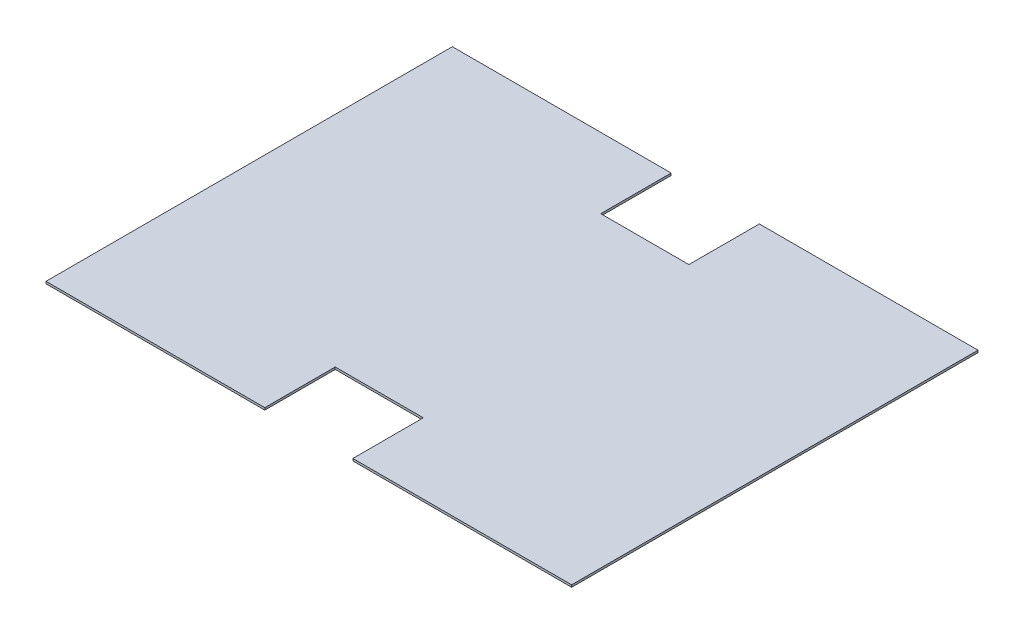
ISO-10303-21;
HEADER;
FILE_DESCRIPTION(('STEP AP214'),'2;1');
FILE_NAME('part.step','',(''),(''),'','','');
FILE_SCHEMA(('AUTOMOTIVE_DESIGN { 1 0 10303 214 1 1 1 1 }'));
ENDSEC;
DATA;
#1=APPLICATION_CONTEXT('core data for automotive mechanical design processes');
#2=APPLICATION_PROTOCOL_DEFINITION('international standard','automotive_design',2000,#1);
#3=PRODUCT_CONTEXT('',#1,'mechanical');
#4=PRODUCT('Part','Part','',(#3));
#5=PRODUCT_RELATED_PRODUCT_CATEGORY('part','',(#4));
#6=PRODUCT_DEFINITION_FORMATION('','',#4);
#7=PRODUCT_DEFINITION_CONTEXT('part definition',#1,'design');
#8=PRODUCT_DEFINITION('design','',#6,#7);
#9=PRODUCT_DEFINITION_SHAPE('','',#8);
#10=(LENGTH_UNIT() NAMED_UNIT(*) SI_UNIT(.MILLI.,.METRE.));
#11=(NAMED_UNIT(*) PLANE_ANGLE_UNIT() SI_UNIT($,.RADIAN.));
#12=(NAMED_UNIT(*) SI_UNIT($,.STERADIAN.) SOLID_ANGLE_UNIT());
#13=UNCERTAINTY_MEASURE_WITH_UNIT(LENGTH_MEASURE(1.E-05),#10,'distance_accuracy_value','');
#14=(GEOMETRIC_REPRESENTATION_CONTEXT(3) GLOBAL_UNCERTAINTY_ASSIGNED_CONTEXT((#13)) GLOBAL_UNIT_ASSIGNED_CONTEXT((#10,
#11,#12)) REPRESENTATION_CONTEXT('',''));
#15=CARTESIAN_POINT('',(0.,0.,0.));
#16=DIRECTION('',(0.,0.,1.));
#17=DIRECTION('',(1.,0.,0.));
#18=AXIS2_PLACEMENT_3D('',#15,#16,#17);
#19=CARTESIAN_POINT('',(379.095,3.175,-293.0525));
#20=DIRECTION('',(0.,0.,1.));
#21=DIRECTION('',(1.,0.,0.));
#22=AXIS2_PLACEMENT_3D('',#19,#20,#21);
#23=PLANE('',#22);
#24=DIRECTION('',(-1.,0.,0.));
#25=VECTOR('',#24,1.);
#26=CARTESIAN_POINT('',(379.095,0.,-293.0525));
#27=LINE('',#26,#25);
#28=CARTESIAN_POINT('',(379.095,0.,-293.0525));
#29=VERTEX_POINT('',#28);
#30=CARTESIAN_POINT('',(63.6782098976773,0.,-293.0525));
#31=VERTEX_POINT('',#30);
#32=EDGE_CURVE('E145',#29,#31,#27,.T.);
#33=ORIENTED_EDGE('',*,*,#32,.T.);
#34=DIRECTION('',(0.,1.,0.));
#35=VECTOR('',#34,1.);
#36=CARTESIAN_POINT('',(63.6782098976773,-0.00100000000000013,-293.0525));
#37=LINE('',#36,#35);
#38=CARTESIAN_POINT('',(63.6782098976773,3.175,-293.0525));
#39=VERTEX_POINT('',#38);
#40=EDGE_CURVE('E130',#31,#39,#37,.T.);
#41=ORIENTED_EDGE('',*,*,#40,.T.);
#42=DIRECTION('',(-1.,0.,0.));
#43=VECTOR('',#42,1.);
#44=CARTESIAN_POINT('',(379.095,3.175,-293.0525));
#45=LINE('',#44,#43);
#46=CARTESIAN_POINT('',(379.095,3.175,-293.0525));
#47=VERTEX_POINT('',#46);
#48=EDGE_CURVE('E157',#47,#39,#45,.T.);
#49=ORIENTED_EDGE('',*,*,#48,.F.);
#50=DIRECTION('',(0.,-1.,0.));
#51=VECTOR('',#50,1.);
#52=CARTESIAN_POINT('',(379.095,3.175,-293.0525));
#53=LINE('',#52,#51);
#54=EDGE_CURVE('E156',#47,#29,#53,.T.);
#55=ORIENTED_EDGE('',*,*,#54,.T.);
#56=EDGE_LOOP('',(#33,#41,#49,#55));
#57=FACE_BOUND('',#56,.T.);
#58=ADVANCED_FACE('F33',(#57),#23,.F.);
#59=CARTESIAN_POINT('',(379.095,3.175,293.0525));
#60=DIRECTION('',(0.,0.,-1.));
#61=DIRECTION('',(-1.,0.,0.));
#62=AXIS2_PLACEMENT_3D('',#59,#60,#61);
#63=PLANE('',#62);
#64=DIRECTION('',(1.,0.,0.));
#65=VECTOR('',#64,1.);
#66=CARTESIAN_POINT('',(379.095,0.,293.0525));
#67=LINE('',#66,#65);
#68=CARTESIAN_POINT('',(-379.095,0.,293.0525));
#69=VERTEX_POINT('',#68);
#70=CARTESIAN_POINT('',(-63.4999999999999,0.,293.0525));
#71=VERTEX_POINT('',#70);
#72=EDGE_CURVE('E150',#69,#71,#67,.T.);
#73=ORIENTED_EDGE('',*,*,#72,.T.);
#74=DIRECTION('',(0.,1.,0.));
#75=VECTOR('',#74,1.);
#76=CARTESIAN_POINT('',(-63.4999999999999,-0.00100000000000013,293.0525));
#77=LINE('',#76,#75);
#78=CARTESIAN_POINT('',(-63.4999999999999,3.175,293.0525));
#79=VERTEX_POINT('',#78);
#80=EDGE_CURVE('E207',#71,#79,#77,.T.);
#81=ORIENTED_EDGE('',*,*,#80,.T.);
#82=DIRECTION('',(1.,0.,0.));
#83=VECTOR('',#82,1.);
#84=CARTESIAN_POINT('',(379.095,3.175,293.0525));
#85=LINE('',#84,#83);
#86=CARTESIAN_POINT('',(-379.095,3.175,293.0525));
#87=VERTEX_POINT('',#86);
#88=EDGE_CURVE('E209',#87,#79,#85,.T.);
#89=ORIENTED_EDGE('',*,*,#88,.F.);
#90=DIRECTION('',(0.,-1.,0.));
#91=VECTOR('',#90,1.);
#92=CARTESIAN_POINT('',(-379.095,3.175,293.0525));
#93=LINE('',#92,#91);
#94=EDGE_CURVE('E11',#87,#69,#93,.T.);
#95=ORIENTED_EDGE('',*,*,#94,.T.);
#96=EDGE_LOOP('',(#73,#81,#89,#95));
#97=FACE_BOUND('',#96,.T.);
#98=ADVANCED_FACE('F253',(#97),#63,.F.);
#99=CARTESIAN_POINT('',(-379.095,3.175,293.0525));
#100=DIRECTION('',(1.,0.,0.));
#101=DIRECTION('',(0.,0.,-1.));
#102=AXIS2_PLACEMENT_3D('',#99,#100,#101);
#103=PLANE('',#102);
#104=DIRECTION('',(0.,0.,1.));
#105=VECTOR('',#104,1.);
#106=CARTESIAN_POINT('',(-379.095,0.,293.0525));
#107=LINE('',#106,#105);
#108=CARTESIAN_POINT('',(-379.095,0.,-293.0525));
#109=VERTEX_POINT('',#108);
#110=EDGE_CURVE('E144',#109,#69,#107,.T.);
#111=ORIENTED_EDGE('',*,*,#110,.T.);
#112=ORIENTED_EDGE('',*,*,#94,.F.);
#113=DIRECTION('',(0.,0.,1.));
#114=VECTOR('',#113,1.);
#115=CARTESIAN_POINT('',(-379.095,3.175,293.0525));
#116=LINE('',#115,#114);
#117=CARTESIAN_POINT('',(-379.095,3.175,-293.0525));
#118=VERTEX_POINT('',#117);
#119=EDGE_CURVE('E149',#118,#87,#116,.T.);
#120=ORIENTED_EDGE('',*,*,#119,.F.);
#121=DIRECTION('',(0.,-1.,0.));
#122=VECTOR('',#121,1.);
#123=CARTESIAN_POINT('',(-379.095,3.175,-293.0525));
#124=LINE('',#123,#122);
#125=EDGE_CURVE('E154',#118,#109,#124,.T.);
#126=ORIENTED_EDGE('',*,*,#125,.T.);
#127=EDGE_LOOP('',(#111,#112,#120,#126));
#128=FACE_BOUND('',#127,.T.);
#129=ADVANCED_FACE('F35',(#128),#103,.F.);
#130=CARTESIAN_POINT('',(63.5000000000001,3.175,293.0525));
#131=VERTEX_POINT('',#130);
#132=CARTESIAN_POINT('',(379.095,3.175,293.0525));
#133=VERTEX_POINT('',#132);
#134=EDGE_CURVE('E193',#131,#133,#85,.T.);
#135=ORIENTED_EDGE('',*,*,#134,.F.);
#136=DIRECTION('',(0.,1.,0.));
#137=VECTOR('',#136,1.);
#138=CARTESIAN_POINT('',(63.5000000000001,-0.00100000000000013,293.0525));
#139=LINE('',#138,#137);
#140=CARTESIAN_POINT('',(63.5000000000001,0.,293.0525));
#141=VERTEX_POINT('',#140);
#142=EDGE_CURVE('E192',#141,#131,#139,.T.);
#143=ORIENTED_EDGE('',*,*,#142,.F.);
#144=CARTESIAN_POINT('',(379.095,0.,293.0525));
#145=VERTEX_POINT('',#144);
#146=EDGE_CURVE('E172',#141,#145,#67,.T.);
#147=ORIENTED_EDGE('',*,*,#146,.T.);
#148=DIRECTION('',(0.,-1.,0.));
#149=VECTOR('',#148,1.);
#150=CARTESIAN_POINT('',(379.095,3.175,293.0525));
#151=LINE('',#150,#149);
#152=EDGE_CURVE('E41',#133,#145,#151,.T.);
#153=ORIENTED_EDGE('',*,*,#152,.F.);
#154=EDGE_LOOP('',(#135,#143,#147,#153));
#155=FACE_BOUND('',#154,.T.);
#156=ADVANCED_FACE('F191',(#155),#63,.F.);
#157=CARTESIAN_POINT('',(379.095,3.175,293.0525));
#158=DIRECTION('',(-1.,0.,0.));
#159=DIRECTION('',(0.,0.,1.));
#160=AXIS2_PLACEMENT_3D('',#157,#158,#159);
#161=PLANE('',#160);
#162=DIRECTION('',(0.,0.,-1.));
#163=VECTOR('',#162,1.);
#164=CARTESIAN_POINT('',(379.095,0.,293.0525));
#165=LINE('',#164,#163);
#166=EDGE_CURVE('E146',#145,#29,#165,.T.);
#167=ORIENTED_EDGE('',*,*,#166,.T.);
#168=ORIENTED_EDGE('',*,*,#54,.F.);
#169=DIRECTION('',(0.,0.,-1.));
#170=VECTOR('',#169,1.);
#171=CARTESIAN_POINT('',(379.095,3.175,293.0525));
#172=LINE('',#171,#170);
#173=EDGE_CURVE('E166',#133,#47,#172,.T.);
#174=ORIENTED_EDGE('',*,*,#173,.F.);
#175=ORIENTED_EDGE('',*,*,#152,.T.);
#176=EDGE_LOOP('',(#167,#168,#174,#175));
#177=FACE_BOUND('',#176,.T.);
#178=ADVANCED_FACE('F164',(#177),#161,.F.);
#179=CARTESIAN_POINT('',(-63.4999999999999,3.175,-293.0525));
#180=VERTEX_POINT('',#179);
#181=EDGE_CURVE('E138',#180,#118,#45,.T.);
#182=ORIENTED_EDGE('',*,*,#181,.F.);
#183=DIRECTION('',(0.,1.,0.));
#184=VECTOR('',#183,1.);
#185=CARTESIAN_POINT('',(-63.4999999999999,-0.00100000000000013,-293.0525));
#186=LINE('',#185,#184);
#187=CARTESIAN_POINT('',(-63.4999999999999,0.,-293.0525));
#188=VERTEX_POINT('',#187);
#189=EDGE_CURVE('E125',#188,#180,#186,.T.);
#190=ORIENTED_EDGE('',*,*,#189,.F.);
#191=EDGE_CURVE('E136',#188,#109,#27,.T.);
#192=ORIENTED_EDGE('',*,*,#191,.T.);
#193=ORIENTED_EDGE('',*,*,#125,.F.);
#194=EDGE_LOOP('',(#182,#190,#192,#193));
#195=FACE_BOUND('',#194,.T.);
#196=ADVANCED_FACE('F134',(#195),#23,.F.);
#197=CARTESIAN_POINT('',(0.,3.175,0.));
#198=DIRECTION('',(0.,1.,0.));
#199=DIRECTION('',(0.,0.,1.));
#200=AXIS2_PLACEMENT_3D('',#197,#198,#199);
#201=PLANE('',#200);
#202=DIRECTION('',(0.,0.,-1.));
#203=VECTOR('',#202,1.);
#204=CARTESIAN_POINT('',(63.6782098976773,3.175,-293.0525));
#205=LINE('',#204,#203);
#206=CARTESIAN_POINT('',(63.6782098976773,3.175,-191.4525));
#207=VERTEX_POINT('',#206);
#208=EDGE_CURVE('E139',#207,#39,#205,.T.);
#209=ORIENTED_EDGE('',*,*,#208,.F.);
#210=DIRECTION('',(1.,0.,0.));
#211=VECTOR('',#210,1.);
#212=CARTESIAN_POINT('',(-63.4999999999999,3.175,-191.4525));
#213=LINE('',#212,#211);
#214=CARTESIAN_POINT('',(-63.4999999999999,3.175,-191.4525));
#215=VERTEX_POINT('',#214);
#216=EDGE_CURVE('E234',#215,#207,#213,.T.);
#217=ORIENTED_EDGE('',*,*,#216,.F.);
#218=DIRECTION('',(0.,0.,1.));
#219=VECTOR('',#218,1.);
#220=CARTESIAN_POINT('',(-63.4999999999999,3.175,-293.0525));
#221=LINE('',#220,#219);
#222=EDGE_CURVE('E237',#180,#215,#221,.T.);
#223=ORIENTED_EDGE('',*,*,#222,.F.);
#224=ORIENTED_EDGE('',*,*,#181,.T.);
#225=ORIENTED_EDGE('',*,*,#119,.T.);
#226=ORIENTED_EDGE('',*,*,#88,.T.);
#227=DIRECTION('',(0.,0.,1.));
#228=VECTOR('',#227,1.);
#229=CARTESIAN_POINT('',(-63.4999999999999,3.175,293.0525));
#230=LINE('',#229,#228);
#231=CARTESIAN_POINT('',(-63.4999999999999,3.175,191.4525));
#232=VERTEX_POINT('',#231);
#233=EDGE_CURVE('E198',#232,#79,#230,.T.);
#234=ORIENTED_EDGE('',*,*,#233,.F.);
#235=DIRECTION('',(-1.,0.,0.));
#236=VECTOR('',#235,1.);
#237=CARTESIAN_POINT('',(63.5000000000001,3.175,191.4525));
#238=LINE('',#237,#236);
#239=CARTESIAN_POINT('',(63.5000000000001,3.175,191.4525));
#240=VERTEX_POINT('',#239);
#241=EDGE_CURVE('E202',#240,#232,#238,.T.);
#242=ORIENTED_EDGE('',*,*,#241,.F.);
#243=DIRECTION('',(0.,0.,-1.));
#244=VECTOR('',#243,1.);
#245=CARTESIAN_POINT('',(63.5000000000001,3.175,293.0525));
#246=LINE('',#245,#244);
#247=EDGE_CURVE('E214',#131,#240,#246,.T.);
#248=ORIENTED_EDGE('',*,*,#247,.F.);
#249=ORIENTED_EDGE('',*,*,#134,.T.);
#250=ORIENTED_EDGE('',*,*,#173,.T.);
#251=ORIENTED_EDGE('',*,*,#48,.T.);
#252=EDGE_LOOP('',(#209,#217,#223,#224,#225,#226,#234,#242,#248,#249,#250,#251));
#253=FACE_BOUND('',#252,.T.);
#254=ADVANCED_FACE('F212',(#253),#201,.T.);
#255=CARTESIAN_POINT('',(0.,0.,0.));
#256=DIRECTION('',(0.,1.,0.));
#257=DIRECTION('',(0.,0.,1.));
#258=AXIS2_PLACEMENT_3D('',#255,#256,#257);
#259=PLANE('',#258);
#260=DIRECTION('',(-1.,0.,0.));
#261=VECTOR('',#260,1.);
#262=CARTESIAN_POINT('',(-63.4999999999999,0.,-191.4525));
#263=LINE('',#262,#261);
#264=CARTESIAN_POINT('',(63.6782098976773,0.,-191.4525));
#265=VERTEX_POINT('',#264);
#266=CARTESIAN_POINT('',(-63.4999999999999,0.,-191.4525));
#267=VERTEX_POINT('',#266);
#268=EDGE_CURVE('E48',#265,#267,#263,.T.);
#269=ORIENTED_EDGE('',*,*,#268,.F.);
#270=DIRECTION('',(0.,0.,1.));
#271=VECTOR('',#270,1.);
#272=CARTESIAN_POINT('',(63.6782098976773,0.,-293.0525));
#273=LINE('',#272,#271);
#274=EDGE_CURVE('E175',#31,#265,#273,.T.);
#275=ORIENTED_EDGE('',*,*,#274,.F.);
#276=ORIENTED_EDGE('',*,*,#32,.F.);
#277=ORIENTED_EDGE('',*,*,#166,.F.);
#278=ORIENTED_EDGE('',*,*,#146,.F.);
#279=DIRECTION('',(0.,0.,1.));
#280=VECTOR('',#279,1.);
#281=CARTESIAN_POINT('',(63.5000000000001,0.,293.0525));
#282=LINE('',#281,#280);
#283=CARTESIAN_POINT('',(63.5000000000001,0.,191.4525));
#284=VERTEX_POINT('',#283);
#285=EDGE_CURVE('E186',#284,#141,#282,.T.);
#286=ORIENTED_EDGE('',*,*,#285,.F.);
#287=DIRECTION('',(1.,0.,0.));
#288=VECTOR('',#287,1.);
#289=CARTESIAN_POINT('',(63.5000000000001,0.,191.4525));
#290=LINE('',#289,#288);
#291=CARTESIAN_POINT('',(-63.4999999999999,0.,191.4525));
#292=VERTEX_POINT('',#291);
#293=EDGE_CURVE('E56',#292,#284,#290,.T.);
#294=ORIENTED_EDGE('',*,*,#293,.F.);
#295=DIRECTION('',(0.,0.,-1.));
#296=VECTOR('',#295,1.);
#297=CARTESIAN_POINT('',(-63.4999999999999,0.,293.0525));
#298=LINE('',#297,#296);
#299=EDGE_CURVE('E216',#71,#292,#298,.T.);
#300=ORIENTED_EDGE('',*,*,#299,.F.);
#301=ORIENTED_EDGE('',*,*,#72,.F.);
#302=ORIENTED_EDGE('',*,*,#110,.F.);
#303=ORIENTED_EDGE('',*,*,#191,.F.);
#304=DIRECTION('',(0.,0.,-1.));
#305=VECTOR('',#304,1.);
#306=CARTESIAN_POINT('',(-63.4999999999999,0.,-293.0525));
#307=LINE('',#306,#305);
#308=EDGE_CURVE('E121',#267,#188,#307,.T.);
#309=ORIENTED_EDGE('',*,*,#308,.F.);
#310=EDGE_LOOP('',(#269,#275,#276,#277,#278,#286,#294,#300,#301,#302,#303,#309));
#311=FACE_BOUND('',#310,.T.);
#312=ADVANCED_FACE('F142',(#311),#259,.F.);
#313=CARTESIAN_POINT('',(-63.4999999999999,-0.00100000000000013,293.0525));
#314=DIRECTION('',(-1.,0.,0.));
#315=DIRECTION('',(0.,0.,1.));
#316=AXIS2_PLACEMENT_3D('',#313,#314,#315);
#317=PLANE('',#316);
#318=ORIENTED_EDGE('',*,*,#299,.T.);
#319=DIRECTION('',(0.,1.,0.));
#320=VECTOR('',#319,1.);
#321=CARTESIAN_POINT('',(-63.4999999999999,-0.00100000000000013,191.4525));
#322=LINE('',#321,#320);
#323=EDGE_CURVE('E200',#292,#232,#322,.T.);
#324=ORIENTED_EDGE('',*,*,#323,.T.);
#325=ORIENTED_EDGE('',*,*,#233,.T.);
#326=ORIENTED_EDGE('',*,*,#80,.F.);
#327=EDGE_LOOP('',(#318,#324,#325,#326));
#328=FACE_BOUND('',#327,.T.);
#329=ADVANCED_FACE('F224',(#328),#317,.F.);
#330=CARTESIAN_POINT('',(63.5000000000001,-0.00100000000000013,191.4525));
#331=DIRECTION('',(0.,0.,-1.));
#332=DIRECTION('',(-1.,0.,0.));
#333=AXIS2_PLACEMENT_3D('',#330,#331,#332);
#334=PLANE('',#333);
#335=ORIENTED_EDGE('',*,*,#293,.T.);
#336=DIRECTION('',(0.,1.,0.));
#337=VECTOR('',#336,1.);
#338=CARTESIAN_POINT('',(63.5000000000001,-0.00100000000000013,191.4525));
#339=LINE('',#338,#337);
#340=EDGE_CURVE('E197',#284,#240,#339,.T.);
#341=ORIENTED_EDGE('',*,*,#340,.T.);
#342=ORIENTED_EDGE('',*,*,#241,.T.);
#343=ORIENTED_EDGE('',*,*,#323,.F.);
#344=EDGE_LOOP('',(#335,#341,#342,#343));
#345=FACE_BOUND('',#344,.T.);
#346=ADVANCED_FACE('F226',(#345),#334,.F.);
#347=CARTESIAN_POINT('',(63.5000000000001,-0.00100000000000013,293.0525));
#348=DIRECTION('',(1.,0.,0.));
#349=DIRECTION('',(0.,0.,-1.));
#350=AXIS2_PLACEMENT_3D('',#347,#348,#349);
#351=PLANE('',#350);
#352=ORIENTED_EDGE('',*,*,#285,.T.);
#353=ORIENTED_EDGE('',*,*,#142,.T.);
#354=ORIENTED_EDGE('',*,*,#247,.T.);
#355=ORIENTED_EDGE('',*,*,#340,.F.);
#356=EDGE_LOOP('',(#352,#353,#354,#355));
#357=FACE_BOUND('',#356,.T.);
#358=ADVANCED_FACE('F227',(#357),#351,.F.);
#359=CARTESIAN_POINT('',(63.6782098976773,-0.00100000000000013,-293.0525));
#360=DIRECTION('',(1.,0.,0.));
#361=DIRECTION('',(0.,0.,-1.));
#362=AXIS2_PLACEMENT_3D('',#359,#360,#361);
#363=PLANE('',#362);
#364=ORIENTED_EDGE('',*,*,#274,.T.);
#365=DIRECTION('',(0.,1.,0.));
#366=VECTOR('',#365,1.);
#367=CARTESIAN_POINT('',(63.6782098976773,-0.00100000000000013,-191.4525));
#368=LINE('',#367,#366);
#369=EDGE_CURVE('E230',#265,#207,#368,.T.);
#370=ORIENTED_EDGE('',*,*,#369,.T.);
#371=ORIENTED_EDGE('',*,*,#208,.T.);
#372=ORIENTED_EDGE('',*,*,#40,.F.);
#373=EDGE_LOOP('',(#364,#370,#371,#372));
#374=FACE_BOUND('',#373,.T.);
#375=ADVANCED_FACE('F241',(#374),#363,.F.);
#376=CARTESIAN_POINT('',(-63.4999999999999,-0.00100000000000013,-191.4525));
#377=DIRECTION('',(0.,0.,1.));
#378=DIRECTION('',(1.,0.,0.));
#379=AXIS2_PLACEMENT_3D('',#376,#377,#378);
#380=PLANE('',#379);
#381=ORIENTED_EDGE('',*,*,#268,.T.);
#382=DIRECTION('',(0.,1.,0.));
#383=VECTOR('',#382,1.);
#384=CARTESIAN_POINT('',(-63.4999999999999,-0.00100000000000013,-191.4525));
#385=LINE('',#384,#383);
#386=EDGE_CURVE('E127',#267,#215,#385,.T.);
#387=ORIENTED_EDGE('',*,*,#386,.T.);
#388=ORIENTED_EDGE('',*,*,#216,.T.);
#389=ORIENTED_EDGE('',*,*,#369,.F.);
#390=EDGE_LOOP('',(#381,#387,#388,#389));
#391=FACE_BOUND('',#390,.T.);
#392=ADVANCED_FACE('F243',(#391),#380,.F.);
#393=CARTESIAN_POINT('',(-63.4999999999999,-0.00100000000000013,-293.0525));
#394=DIRECTION('',(-1.,0.,0.));
#395=DIRECTION('',(0.,0.,1.));
#396=AXIS2_PLACEMENT_3D('',#393,#394,#395);
#397=PLANE('',#396);
#398=ORIENTED_EDGE('',*,*,#308,.T.);
#399=ORIENTED_EDGE('',*,*,#189,.T.);
#400=ORIENTED_EDGE('',*,*,#222,.T.);
#401=ORIENTED_EDGE('',*,*,#386,.F.);
#402=EDGE_LOOP('',(#398,#399,#400,#401));
#403=FACE_BOUND('',#402,.T.);
#404=ADVANCED_FACE('F123',(#403),#397,.F.);
#405=CLOSED_SHELL('',(#58,#98,#129,#156,#178,#196,#254,#312,#329,#346,#358,#375,#392,#404));
#406=MANIFOLD_SOLID_BREP('B2',#405);
#407=ADVANCED_BREP_SHAPE_REPRESENTATION('',(#18,#406),#14);
#408=SHAPE_DEFINITION_REPRESENTATION(#9,#407);
ENDSEC;
END-ISO-10303-21;
